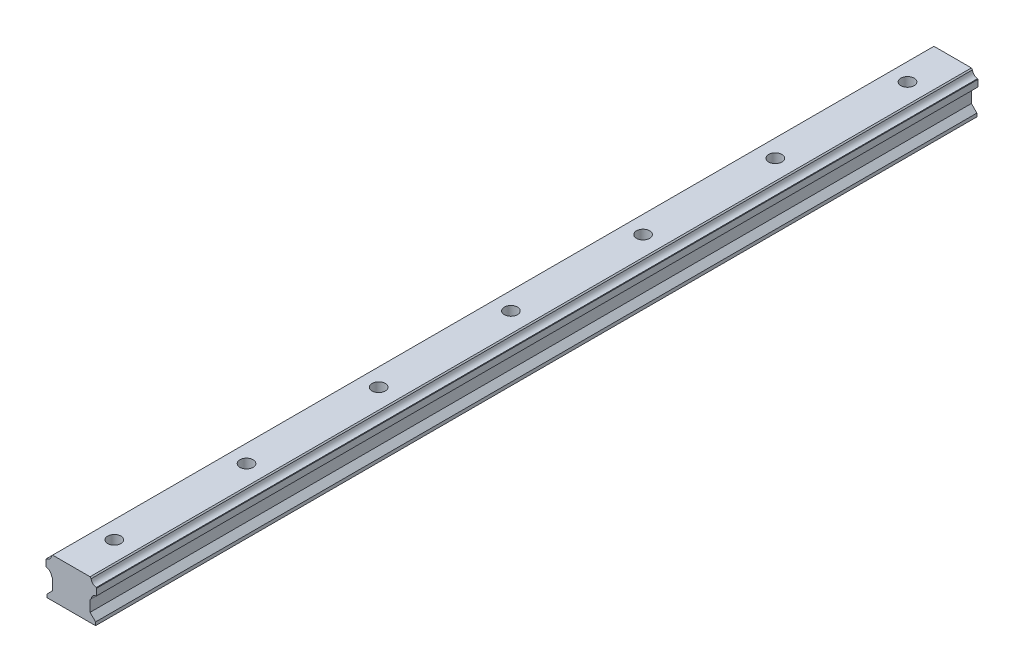
ISO-10303-21;
HEADER;
FILE_DESCRIPTION(('STEP AP214'),'2;1');
FILE_NAME('part.step','',(''),(''),'','','');
FILE_SCHEMA(('AUTOMOTIVE_DESIGN { 1 0 10303 214 1 1 1 1 }'));
ENDSEC;
DATA;
#1=APPLICATION_CONTEXT('core data for automotive mechanical design processes');
#2=APPLICATION_PROTOCOL_DEFINITION('international standard','automotive_design',2000,#1);
#3=PRODUCT_CONTEXT('',#1,'mechanical');
#4=PRODUCT('Part','Part','',(#3));
#5=PRODUCT_RELATED_PRODUCT_CATEGORY('part','',(#4));
#6=PRODUCT_DEFINITION_FORMATION('','',#4);
#7=PRODUCT_DEFINITION_CONTEXT('part definition',#1,'design');
#8=PRODUCT_DEFINITION('design','',#6,#7);
#9=PRODUCT_DEFINITION_SHAPE('','',#8);
#10=(LENGTH_UNIT() NAMED_UNIT(*) SI_UNIT(.MILLI.,.METRE.));
#11=(NAMED_UNIT(*) PLANE_ANGLE_UNIT() SI_UNIT($,.RADIAN.));
#12=(NAMED_UNIT(*) SI_UNIT($,.STERADIAN.) SOLID_ANGLE_UNIT());
#13=UNCERTAINTY_MEASURE_WITH_UNIT(LENGTH_MEASURE(1.E-05),#10,'distance_accuracy_value','');
#14=(GEOMETRIC_REPRESENTATION_CONTEXT(3) GLOBAL_UNCERTAINTY_ASSIGNED_CONTEXT((#13)) GLOBAL_UNIT_ASSIGNED_CONTEXT((#10,
#11,#12)) REPRESENTATION_CONTEXT('',''));
#15=CARTESIAN_POINT('',(0.,0.,0.));
#16=DIRECTION('',(0.,0.,1.));
#17=DIRECTION('',(1.,0.,0.));
#18=AXIS2_PLACEMENT_3D('',#15,#16,#17);
#19=CARTESIAN_POINT('',(-10.0012116020146,-16.2762221715419,400.));
#20=DIRECTION('',(1.,0.,0.));
#21=DIRECTION('',(0.,0.,-1.));
#22=AXIS2_PLACEMENT_3D('',#19,#20,#21);
#23=PLANE('',#22);
#24=DIRECTION('',(0.,-1.,0.));
#25=VECTOR('',#24,1.);
#26=CARTESIAN_POINT('',(-10.0012116020146,-16.2762221715419,0.));
#27=LINE('',#26,#25);
#28=CARTESIAN_POINT('',(-10.0012116020146,-16.2762221715419,0.));
#29=VERTEX_POINT('',#28);
#30=CARTESIAN_POINT('',(-10.0012116020146,-17.7762221715421,0.));
#31=VERTEX_POINT('',#30);
#32=EDGE_CURVE('E215',#29,#31,#27,.T.);
#33=ORIENTED_EDGE('',*,*,#32,.T.);
#34=DIRECTION('',(0.,0.,-1.));
#35=VECTOR('',#34,1.);
#36=CARTESIAN_POINT('',(-10.0012116020146,-17.7762221715421,400.));
#37=LINE('',#36,#35);
#38=CARTESIAN_POINT('',(-10.0012116020146,-17.7762221715421,400.));
#39=VERTEX_POINT('',#38);
#40=EDGE_CURVE('E313',#39,#31,#37,.T.);
#41=ORIENTED_EDGE('',*,*,#40,.F.);
#42=DIRECTION('',(0.,-1.,0.));
#43=VECTOR('',#42,1.);
#44=CARTESIAN_POINT('',(-10.0012116020146,-16.2762221715419,400.));
#45=LINE('',#44,#43);
#46=CARTESIAN_POINT('',(-10.0012116020146,-16.2762221715419,400.));
#47=VERTEX_POINT('',#46);
#48=EDGE_CURVE('E258',#47,#39,#45,.T.);
#49=ORIENTED_EDGE('',*,*,#48,.F.);
#50=DIRECTION('',(0.,0.,-1.));
#51=VECTOR('',#50,1.);
#52=CARTESIAN_POINT('',(-10.0012116020146,-16.2762221715419,400.));
#53=LINE('',#52,#51);
#54=EDGE_CURVE('E211',#47,#29,#53,.T.);
#55=ORIENTED_EDGE('',*,*,#54,.T.);
#56=EDGE_LOOP('',(#33,#41,#49,#55));
#57=FACE_BOUND('',#56,.T.);
#58=ADVANCED_FACE('F33',(#57),#23,.F.);
#59=CARTESIAN_POINT('',(-10.0012116020146,-17.7762221715421,400.));
#60=DIRECTION('',(0.,1.,0.));
#61=DIRECTION('',(0.,0.,1.));
#62=AXIS2_PLACEMENT_3D('',#59,#60,#61);
#63=PLANE('',#62);
#64=CARTESIAN_POINT('',(0.499394198992774,-17.7762221715421,20.0000000000001));
#65=DIRECTION('',(0.,1.,0.));
#66=DIRECTION('',(0.,0.,1.));
#67=AXIS2_PLACEMENT_3D('',#64,#65,#66);
#68=CIRCLE('',#67,3.);
#69=CARTESIAN_POINT('',(0.499394198992774,-17.7762221715421,23.0000000000001));
#70=VERTEX_POINT('',#69);
#71=EDGE_CURVE('E488',#70,#70,#68,.T.);
#72=ORIENTED_EDGE('',*,*,#71,.T.);
#73=EDGE_LOOP('',(#72));
#74=FACE_BOUND('',#73,.T.);
#75=CARTESIAN_POINT('',(0.499394198992774,-17.7762221715421,80.0000000000001));
#76=DIRECTION('',(0.,1.,0.));
#77=DIRECTION('',(0.,0.,1.));
#78=AXIS2_PLACEMENT_3D('',#75,#76,#77);
#79=CIRCLE('',#78,3.);
#80=CARTESIAN_POINT('',(0.499394198992774,-17.7762221715421,83.0000000000001));
#81=VERTEX_POINT('',#80);
#82=EDGE_CURVE('E482',#81,#81,#79,.T.);
#83=ORIENTED_EDGE('',*,*,#82,.T.);
#84=EDGE_LOOP('',(#83));
#85=FACE_BOUND('',#84,.T.);
#86=CARTESIAN_POINT('',(0.499394198992774,-17.7762221715421,140.));
#87=DIRECTION('',(0.,1.,0.));
#88=DIRECTION('',(0.,0.,1.));
#89=AXIS2_PLACEMENT_3D('',#86,#87,#88);
#90=CIRCLE('',#89,3.);
#91=CARTESIAN_POINT('',(0.499394198992774,-17.7762221715421,143.));
#92=VERTEX_POINT('',#91);
#93=EDGE_CURVE('E478',#92,#92,#90,.T.);
#94=ORIENTED_EDGE('',*,*,#93,.T.);
#95=EDGE_LOOP('',(#94));
#96=FACE_BOUND('',#95,.T.);
#97=CARTESIAN_POINT('',(0.499394198992774,-17.7762221715421,260.));
#98=DIRECTION('',(0.,1.,0.));
#99=DIRECTION('',(0.,0.,1.));
#100=AXIS2_PLACEMENT_3D('',#97,#98,#99);
#101=CIRCLE('',#100,3.);
#102=CARTESIAN_POINT('',(0.499394198992774,-17.7762221715421,263.));
#103=VERTEX_POINT('',#102);
#104=EDGE_CURVE('E475',#103,#103,#101,.T.);
#105=ORIENTED_EDGE('',*,*,#104,.T.);
#106=EDGE_LOOP('',(#105));
#107=FACE_BOUND('',#106,.T.);
#108=CARTESIAN_POINT('',(0.499394198992774,-17.7762221715421,200.));
#109=DIRECTION('',(0.,1.,0.));
#110=DIRECTION('',(0.,0.,1.));
#111=AXIS2_PLACEMENT_3D('',#108,#109,#110);
#112=CIRCLE('',#111,3.);
#113=CARTESIAN_POINT('',(0.499394198992774,-17.7762221715421,203.));
#114=VERTEX_POINT('',#113);
#115=EDGE_CURVE('E219',#114,#114,#112,.T.);
#116=ORIENTED_EDGE('',*,*,#115,.T.);
#117=EDGE_LOOP('',(#116));
#118=FACE_BOUND('',#117,.T.);
#119=DIRECTION('',(1.,0.,0.));
#120=VECTOR('',#119,1.);
#121=CARTESIAN_POINT('',(-10.0012116020146,-17.7762221715421,0.));
#122=LINE('',#121,#120);
#123=CARTESIAN_POINT('',(11.9987883979856,-17.7762221715421,0.));
#124=VERTEX_POINT('',#123);
#125=EDGE_CURVE('E218',#31,#124,#122,.T.);
#126=ORIENTED_EDGE('',*,*,#125,.T.);
#127=DIRECTION('',(0.,0.,-1.));
#128=VECTOR('',#127,1.);
#129=CARTESIAN_POINT('',(11.9987883979856,-17.7762221715421,400.));
#130=LINE('',#129,#128);
#131=CARTESIAN_POINT('',(11.9987883979856,-17.7762221715421,400.));
#132=VERTEX_POINT('',#131);
#133=EDGE_CURVE('E310',#132,#124,#130,.T.);
#134=ORIENTED_EDGE('',*,*,#133,.F.);
#135=DIRECTION('',(1.,0.,0.));
#136=VECTOR('',#135,1.);
#137=CARTESIAN_POINT('',(-10.0012116020146,-17.7762221715421,400.));
#138=LINE('',#137,#136);
#139=EDGE_CURVE('E136',#39,#132,#138,.T.);
#140=ORIENTED_EDGE('',*,*,#139,.F.);
#141=ORIENTED_EDGE('',*,*,#40,.T.);
#142=EDGE_LOOP('',(#126,#134,#140,#141));
#143=FACE_BOUND('',#142,.T.);
#144=CARTESIAN_POINT('',(0.499394198992774,-17.7762221715421,320.));
#145=DIRECTION('',(0.,1.,0.));
#146=DIRECTION('',(0.,0.,1.));
#147=AXIS2_PLACEMENT_3D('',#144,#145,#146);
#148=CIRCLE('',#147,3.);
#149=CARTESIAN_POINT('',(0.499394198992774,-17.7762221715421,323.));
#150=VERTEX_POINT('',#149);
#151=EDGE_CURVE('E315',#150,#150,#148,.T.);
#152=ORIENTED_EDGE('',*,*,#151,.T.);
#153=EDGE_LOOP('',(#152));
#154=FACE_BOUND('',#153,.T.);
#155=CARTESIAN_POINT('',(0.499394198992774,-17.7762221715421,380.));
#156=DIRECTION('',(0.,1.,0.));
#157=DIRECTION('',(0.,0.,1.));
#158=AXIS2_PLACEMENT_3D('',#155,#156,#157);
#159=CIRCLE('',#158,3.);
#160=CARTESIAN_POINT('',(0.499394198992774,-17.7762221715421,383.));
#161=VERTEX_POINT('',#160);
#162=EDGE_CURVE('E42',#161,#161,#159,.T.);
#163=ORIENTED_EDGE('',*,*,#162,.T.);
#164=EDGE_LOOP('',(#163));
#165=FACE_BOUND('',#164,.T.);
#166=ADVANCED_FACE('F323',(#74,#85,#96,#107,#118,#143,#154,#165),#63,.F.);
#167=CARTESIAN_POINT('',(11.9987883979856,-17.7762221715421,400.));
#168=DIRECTION('',(-1.,0.,0.));
#169=DIRECTION('',(0.,0.,1.));
#170=AXIS2_PLACEMENT_3D('',#167,#168,#169);
#171=PLANE('',#170);
#172=DIRECTION('',(0.,1.,0.));
#173=VECTOR('',#172,1.);
#174=CARTESIAN_POINT('',(11.9987883979856,-17.7762221715421,0.));
#175=LINE('',#174,#173);
#176=CARTESIAN_POINT('',(11.9987883979856,-16.2762221715418,0.));
#177=VERTEX_POINT('',#176);
#178=EDGE_CURVE('E221',#124,#177,#175,.T.);
#179=ORIENTED_EDGE('',*,*,#178,.T.);
#180=DIRECTION('',(0.,0.,-1.));
#181=VECTOR('',#180,1.);
#182=CARTESIAN_POINT('',(11.9987883979856,-16.2762221715418,400.));
#183=LINE('',#182,#181);
#184=CARTESIAN_POINT('',(11.9987883979856,-16.2762221715418,400.));
#185=VERTEX_POINT('',#184);
#186=EDGE_CURVE('E307',#185,#177,#183,.T.);
#187=ORIENTED_EDGE('',*,*,#186,.F.);
#188=DIRECTION('',(0.,1.,0.));
#189=VECTOR('',#188,1.);
#190=CARTESIAN_POINT('',(11.9987883979856,-17.7762221715421,400.));
#191=LINE('',#190,#189);
#192=EDGE_CURVE('E463',#132,#185,#191,.T.);
#193=ORIENTED_EDGE('',*,*,#192,.F.);
#194=ORIENTED_EDGE('',*,*,#133,.T.);
#195=EDGE_LOOP('',(#179,#187,#193,#194));
#196=FACE_BOUND('',#195,.T.);
#197=ADVANCED_FACE('F355',(#196),#171,.F.);
#198=CARTESIAN_POINT('',(9.49878839798558,-13.7762221715417,400.));
#199=DIRECTION('',(-0.707106781186548,-0.707106781186548,0.));
#200=DIRECTION('',(0.707106781186548,-0.707106781186548,0.));
#201=AXIS2_PLACEMENT_3D('',#198,#199,#200);
#202=PLANE('',#201);
#203=DIRECTION('',(-0.707106781186548,0.707106781186548,0.));
#204=VECTOR('',#203,1.);
#205=CARTESIAN_POINT('',(9.49878839798558,-13.7762221715417,0.));
#206=LINE('',#205,#204);
#207=CARTESIAN_POINT('',(9.49878839798558,-13.7762221715417,0.));
#208=VERTEX_POINT('',#207);
#209=EDGE_CURVE('E223',#177,#208,#206,.T.);
#210=ORIENTED_EDGE('',*,*,#209,.T.);
#211=DIRECTION('',(0.,0.,-1.));
#212=VECTOR('',#211,1.);
#213=CARTESIAN_POINT('',(9.49878839798558,-13.7762221715417,400.));
#214=LINE('',#213,#212);
#215=CARTESIAN_POINT('',(9.49878839798558,-13.7762221715417,400.));
#216=VERTEX_POINT('',#215);
#217=EDGE_CURVE('E304',#216,#208,#214,.T.);
#218=ORIENTED_EDGE('',*,*,#217,.F.);
#219=DIRECTION('',(-0.707106781186548,0.707106781186548,0.));
#220=VECTOR('',#219,1.);
#221=CARTESIAN_POINT('',(9.49878839798558,-13.7762221715417,400.));
#222=LINE('',#221,#220);
#223=EDGE_CURVE('E461',#185,#216,#222,.T.);
#224=ORIENTED_EDGE('',*,*,#223,.F.);
#225=ORIENTED_EDGE('',*,*,#186,.T.);
#226=EDGE_LOOP('',(#210,#218,#224,#225));
#227=FACE_BOUND('',#226,.T.);
#228=ADVANCED_FACE('F567',(#227),#202,.F.);
#229=CARTESIAN_POINT('',(9.49878839798558,-8.77622217154181,400.));
#230=DIRECTION('',(-1.,0.,0.));
#231=DIRECTION('',(0.,0.,1.));
#232=AXIS2_PLACEMENT_3D('',#229,#230,#231);
#233=PLANE('',#232);
#234=DIRECTION('',(0.,1.,0.));
#235=VECTOR('',#234,1.);
#236=CARTESIAN_POINT('',(9.49878839798558,-8.77622217154181,0.));
#237=LINE('',#236,#235);
#238=CARTESIAN_POINT('',(9.49878839798558,-8.77622217154181,0.));
#239=VERTEX_POINT('',#238);
#240=EDGE_CURVE('E225',#208,#239,#237,.T.);
#241=ORIENTED_EDGE('',*,*,#240,.T.);
#242=DIRECTION('',(0.,0.,-1.));
#243=VECTOR('',#242,1.);
#244=CARTESIAN_POINT('',(9.49878839798558,-8.77622217154181,400.));
#245=LINE('',#244,#243);
#246=CARTESIAN_POINT('',(9.49878839798558,-8.77622217154181,400.));
#247=VERTEX_POINT('',#246);
#248=EDGE_CURVE('E301',#247,#239,#245,.T.);
#249=ORIENTED_EDGE('',*,*,#248,.F.);
#250=DIRECTION('',(0.,1.,0.));
#251=VECTOR('',#250,1.);
#252=CARTESIAN_POINT('',(9.49878839798558,-8.77622217154181,400.));
#253=LINE('',#252,#251);
#254=EDGE_CURVE('E459',#216,#247,#253,.T.);
#255=ORIENTED_EDGE('',*,*,#254,.F.);
#256=ORIENTED_EDGE('',*,*,#217,.T.);
#257=EDGE_LOOP('',(#241,#249,#255,#256));
#258=FACE_BOUND('',#257,.T.);
#259=ADVANCED_FACE('F562',(#258),#233,.F.);
#260=CARTESIAN_POINT('',(10.0063729844235,-8.26863758510385,400.));
#261=DIRECTION('',(-0.707106781186548,0.707106781186548,0.));
#262=DIRECTION('',(-0.707106781186548,-0.707106781186548,0.));
#263=AXIS2_PLACEMENT_3D('',#260,#261,#262);
#264=PLANE('',#263);
#265=DIRECTION('',(0.707106781186548,0.707106781186548,0.));
#266=VECTOR('',#265,1.);
#267=CARTESIAN_POINT('',(10.0063729844235,-8.26863758510385,0.));
#268=LINE('',#267,#266);
#269=CARTESIAN_POINT('',(10.0063729844235,-8.26863758510385,0.));
#270=VERTEX_POINT('',#269);
#271=EDGE_CURVE('E227',#239,#270,#268,.T.);
#272=ORIENTED_EDGE('',*,*,#271,.T.);
#273=DIRECTION('',(0.,0.,-1.));
#274=VECTOR('',#273,1.);
#275=CARTESIAN_POINT('',(10.0063729844235,-8.26863758510385,400.));
#276=LINE('',#275,#274);
#277=CARTESIAN_POINT('',(10.0063729844235,-8.26863758510385,400.));
#278=VERTEX_POINT('',#277);
#279=EDGE_CURVE('E298',#278,#270,#276,.T.);
#280=ORIENTED_EDGE('',*,*,#279,.F.);
#281=DIRECTION('',(0.707106781186548,0.707106781186548,0.));
#282=VECTOR('',#281,1.);
#283=CARTESIAN_POINT('',(10.0063729844235,-8.26863758510385,400.));
#284=LINE('',#283,#282);
#285=EDGE_CURVE('E457',#247,#278,#284,.T.);
#286=ORIENTED_EDGE('',*,*,#285,.F.);
#287=ORIENTED_EDGE('',*,*,#248,.T.);
#288=EDGE_LOOP('',(#272,#280,#286,#287));
#289=FACE_BOUND('',#288,.T.);
#290=ADVANCED_FACE('F556',(#289),#264,.F.);
#291=CARTESIAN_POINT('',(12.4987883979856,-8.46322794005069,400.));
#292=DIRECTION('',(0.,0.,-1.));
#293=DIRECTION('',(-1.,0.,0.));
#294=AXIS2_PLACEMENT_3D('',#291,#292,#293);
#295=CYLINDRICAL_SURFACE('',#294,2.5);
#296=CARTESIAN_POINT('',(12.4987883979856,-8.46322794005069,0.));
#297=DIRECTION('',(0.,0.,-1.));
#298=DIRECTION('',(1.,0.,0.));
#299=AXIS2_PLACEMENT_3D('',#296,#297,#298);
#300=CIRCLE('',#299,2.5);
#301=CARTESIAN_POINT('',(12.3041980430387,-5.97081252648865,0.));
#302=VERTEX_POINT('',#301);
#303=EDGE_CURVE('E229',#270,#302,#300,.T.);
#304=ORIENTED_EDGE('',*,*,#303,.T.);
#305=DIRECTION('',(0.,0.,-1.));
#306=VECTOR('',#305,1.);
#307=CARTESIAN_POINT('',(12.3041980430387,-5.97081252648865,400.));
#308=LINE('',#307,#306);
#309=CARTESIAN_POINT('',(12.3041980430387,-5.97081252648865,400.));
#310=VERTEX_POINT('',#309);
#311=EDGE_CURVE('E295',#310,#302,#308,.T.);
#312=ORIENTED_EDGE('',*,*,#311,.F.);
#313=CARTESIAN_POINT('',(12.4987883979856,-8.46322794005069,400.));
#314=DIRECTION('',(0.,0.,-1.));
#315=DIRECTION('',(1.,0.,0.));
#316=AXIS2_PLACEMENT_3D('',#313,#314,#315);
#317=CIRCLE('',#316,2.5);
#318=EDGE_CURVE('E455',#278,#310,#317,.T.);
#319=ORIENTED_EDGE('',*,*,#318,.F.);
#320=ORIENTED_EDGE('',*,*,#279,.T.);
#321=EDGE_LOOP('',(#304,#312,#319,#320));
#322=FACE_BOUND('',#321,.T.);
#323=ADVANCED_FACE('F552',(#322),#295,.F.);
#324=CARTESIAN_POINT('',(12.4987883979856,-5.77622217154175,400.));
#325=DIRECTION('',(-0.707106781186547,0.707106781186547,0.));
#326=DIRECTION('',(-0.707106781186548,-0.707106781186548,0.));
#327=AXIS2_PLACEMENT_3D('',#324,#325,#326);
#328=PLANE('',#327);
#329=DIRECTION('',(0.707106781186547,0.707106781186547,0.));
#330=VECTOR('',#329,1.);
#331=CARTESIAN_POINT('',(12.4987883979856,-5.77622217154175,0.));
#332=LINE('',#331,#330);
#333=CARTESIAN_POINT('',(12.4987883979856,-5.77622217154175,0.));
#334=VERTEX_POINT('',#333);
#335=EDGE_CURVE('E231',#302,#334,#332,.T.);
#336=ORIENTED_EDGE('',*,*,#335,.T.);
#337=DIRECTION('',(0.,0.,-1.));
#338=VECTOR('',#337,1.);
#339=CARTESIAN_POINT('',(12.4987883979856,-5.77622217154175,400.));
#340=LINE('',#339,#338);
#341=CARTESIAN_POINT('',(12.4987883979856,-5.77622217154175,400.));
#342=VERTEX_POINT('',#341);
#343=EDGE_CURVE('E292',#342,#334,#340,.T.);
#344=ORIENTED_EDGE('',*,*,#343,.F.);
#345=DIRECTION('',(0.707106781186547,0.707106781186547,0.));
#346=VECTOR('',#345,1.);
#347=CARTESIAN_POINT('',(12.4987883979856,-5.77622217154175,400.));
#348=LINE('',#347,#346);
#349=EDGE_CURVE('E453',#310,#342,#348,.T.);
#350=ORIENTED_EDGE('',*,*,#349,.F.);
#351=ORIENTED_EDGE('',*,*,#311,.T.);
#352=EDGE_LOOP('',(#336,#344,#350,#351));
#353=FACE_BOUND('',#352,.T.);
#354=ADVANCED_FACE('F547',(#353),#328,.F.);
#355=CARTESIAN_POINT('',(12.4987883979856,-2.77622217154181,400.));
#356=DIRECTION('',(-1.,0.,0.));
#357=DIRECTION('',(0.,0.,1.));
#358=AXIS2_PLACEMENT_3D('',#355,#356,#357);
#359=PLANE('',#358);
#360=DIRECTION('',(0.,1.,0.));
#361=VECTOR('',#360,1.);
#362=CARTESIAN_POINT('',(12.4987883979856,-2.77622217154181,0.));
#363=LINE('',#362,#361);
#364=CARTESIAN_POINT('',(12.4987883979856,-2.77622217154181,0.));
#365=VERTEX_POINT('',#364);
#366=EDGE_CURVE('E233',#334,#365,#363,.T.);
#367=ORIENTED_EDGE('',*,*,#366,.T.);
#368=DIRECTION('',(0.,0.,-1.));
#369=VECTOR('',#368,1.);
#370=CARTESIAN_POINT('',(12.4987883979856,-2.77622217154181,400.));
#371=LINE('',#370,#369);
#372=CARTESIAN_POINT('',(12.4987883979856,-2.77622217154181,400.));
#373=VERTEX_POINT('',#372);
#374=EDGE_CURVE('E289',#373,#365,#371,.T.);
#375=ORIENTED_EDGE('',*,*,#374,.F.);
#376=DIRECTION('',(0.,1.,0.));
#377=VECTOR('',#376,1.);
#378=CARTESIAN_POINT('',(12.4987883979856,-2.77622217154181,400.));
#379=LINE('',#378,#377);
#380=EDGE_CURVE('E451',#342,#373,#379,.T.);
#381=ORIENTED_EDGE('',*,*,#380,.F.);
#382=ORIENTED_EDGE('',*,*,#343,.T.);
#383=EDGE_LOOP('',(#367,#375,#381,#382));
#384=FACE_BOUND('',#383,.T.);
#385=ADVANCED_FACE('F541',(#384),#359,.F.);
#386=CARTESIAN_POINT('',(12.3041980430388,-2.58163181659496,400.));
#387=DIRECTION('',(-0.707106781186547,-0.707106781186547,0.));
#388=DIRECTION('',(0.707106781186548,-0.707106781186548,0.));
#389=AXIS2_PLACEMENT_3D('',#386,#387,#388);
#390=PLANE('',#389);
#391=DIRECTION('',(-0.707106781186547,0.707106781186547,0.));
#392=VECTOR('',#391,1.);
#393=CARTESIAN_POINT('',(12.3041980430388,-2.58163181659496,0.));
#394=LINE('',#393,#392);
#395=CARTESIAN_POINT('',(12.3041980430388,-2.58163181659496,0.));
#396=VERTEX_POINT('',#395);
#397=EDGE_CURVE('E235',#365,#396,#394,.T.);
#398=ORIENTED_EDGE('',*,*,#397,.T.);
#399=DIRECTION('',(0.,0.,-1.));
#400=VECTOR('',#399,1.);
#401=CARTESIAN_POINT('',(12.3041980430388,-2.58163181659496,400.));
#402=LINE('',#401,#400);
#403=CARTESIAN_POINT('',(12.3041980430388,-2.58163181659496,400.));
#404=VERTEX_POINT('',#403);
#405=EDGE_CURVE('E286',#404,#396,#402,.T.);
#406=ORIENTED_EDGE('',*,*,#405,.F.);
#407=DIRECTION('',(-0.707106781186547,0.707106781186547,0.));
#408=VECTOR('',#407,1.);
#409=CARTESIAN_POINT('',(12.3041980430388,-2.58163181659496,400.));
#410=LINE('',#409,#408);
#411=EDGE_CURVE('E449',#373,#404,#410,.T.);
#412=ORIENTED_EDGE('',*,*,#411,.F.);
#413=ORIENTED_EDGE('',*,*,#374,.T.);
#414=EDGE_LOOP('',(#398,#406,#412,#413));
#415=FACE_BOUND('',#414,.T.);
#416=ADVANCED_FACE('F537',(#415),#390,.F.);
#417=CARTESIAN_POINT('',(12.4987883979856,-0.0892164030329295,400.));
#418=DIRECTION('',(0.,0.,-1.));
#419=DIRECTION('',(-1.,0.,0.));
#420=AXIS2_PLACEMENT_3D('',#417,#418,#419);
#421=CYLINDRICAL_SURFACE('',#420,2.49999999999998);
#422=CARTESIAN_POINT('',(12.4987883979856,-0.0892164030329295,0.));
#423=DIRECTION('',(0.,0.,-1.));
#424=DIRECTION('',(1.,0.,0.));
#425=AXIS2_PLACEMENT_3D('',#422,#423,#424);
#426=CIRCLE('',#425,2.49999999999998);
#427=CARTESIAN_POINT('',(10.0063729844236,-0.283806757979913,0.));
#428=VERTEX_POINT('',#427);
#429=EDGE_CURVE('E237',#396,#428,#426,.T.);
#430=ORIENTED_EDGE('',*,*,#429,.T.);
#431=DIRECTION('',(0.,0.,-1.));
#432=VECTOR('',#431,1.);
#433=CARTESIAN_POINT('',(10.0063729844236,-0.283806757979913,400.));
#434=LINE('',#433,#432);
#435=CARTESIAN_POINT('',(10.0063729844236,-0.283806757979913,400.));
#436=VERTEX_POINT('',#435);
#437=EDGE_CURVE('E283',#436,#428,#434,.T.);
#438=ORIENTED_EDGE('',*,*,#437,.F.);
#439=CARTESIAN_POINT('',(12.4987883979856,-0.0892164030329295,400.));
#440=DIRECTION('',(0.,0.,-1.));
#441=DIRECTION('',(1.,0.,0.));
#442=AXIS2_PLACEMENT_3D('',#439,#440,#441);
#443=CIRCLE('',#442,2.49999999999998);
#444=EDGE_CURVE('E447',#404,#436,#443,.T.);
#445=ORIENTED_EDGE('',*,*,#444,.F.);
#446=ORIENTED_EDGE('',*,*,#405,.T.);
#447=EDGE_LOOP('',(#430,#438,#445,#446));
#448=FACE_BOUND('',#447,.T.);
#449=ADVANCED_FACE('F344',(#448),#421,.F.);
#450=CARTESIAN_POINT('',(9.49878839798586,0.223777828457852,400.));
#451=DIRECTION('',(-0.707106781186548,-0.707106781186548,0.));
#452=DIRECTION('',(0.707106781186548,-0.707106781186548,0.));
#453=AXIS2_PLACEMENT_3D('',#450,#451,#452);
#454=PLANE('',#453);
#455=DIRECTION('',(-0.707106781186548,0.707106781186548,0.));
#456=VECTOR('',#455,1.);
#457=CARTESIAN_POINT('',(9.49878839798586,0.223777828457852,0.));
#458=LINE('',#457,#456);
#459=CARTESIAN_POINT('',(9.49878839798586,0.223777828457852,0.));
#460=VERTEX_POINT('',#459);
#461=EDGE_CURVE('E239',#428,#460,#458,.T.);
#462=ORIENTED_EDGE('',*,*,#461,.T.);
#463=DIRECTION('',(0.,0.,-1.));
#464=VECTOR('',#463,1.);
#465=CARTESIAN_POINT('',(9.49878839798586,0.223777828457852,400.));
#466=LINE('',#465,#464);
#467=CARTESIAN_POINT('',(9.49878839798586,0.223777828457852,400.));
#468=VERTEX_POINT('',#467);
#469=EDGE_CURVE('E280',#468,#460,#466,.T.);
#470=ORIENTED_EDGE('',*,*,#469,.F.);
#471=DIRECTION('',(-0.707106781186548,0.707106781186548,0.));
#472=VECTOR('',#471,1.);
#473=CARTESIAN_POINT('',(9.49878839798586,0.223777828457852,400.));
#474=LINE('',#473,#472);
#475=EDGE_CURVE('E445',#436,#468,#474,.T.);
#476=ORIENTED_EDGE('',*,*,#475,.F.);
#477=ORIENTED_EDGE('',*,*,#437,.T.);
#478=EDGE_LOOP('',(#462,#470,#476,#477));
#479=FACE_BOUND('',#478,.T.);
#480=ADVANCED_FACE('F334',(#479),#454,.F.);
#481=CARTESIAN_POINT('',(-7.50121160201476,0.223777828457852,400.));
#482=DIRECTION('',(0.,-1.,0.));
#483=DIRECTION('',(0.,0.,-1.));
#484=AXIS2_PLACEMENT_3D('',#481,#482,#483);
#485=PLANE('',#484);
#486=CARTESIAN_POINT('',(0.499394198992774,0.223777828457852,20.0000000000001));
#487=DIRECTION('',(0.,1.,0.));
#488=DIRECTION('',(0.,0.,1.));
#489=AXIS2_PLACEMENT_3D('',#486,#487,#488);
#490=CIRCLE('',#489,3.);
#491=CARTESIAN_POINT('',(0.499394198992774,0.223777828457852,23.0000000000001));
#492=VERTEX_POINT('',#491);
#493=EDGE_CURVE('E491',#492,#492,#490,.T.);
#494=ORIENTED_EDGE('',*,*,#493,.F.);
#495=EDGE_LOOP('',(#494));
#496=FACE_BOUND('',#495,.T.);
#497=CARTESIAN_POINT('',(0.499394198992774,0.223777828457852,80.0000000000001));
#498=DIRECTION('',(0.,1.,0.));
#499=DIRECTION('',(0.,0.,1.));
#500=AXIS2_PLACEMENT_3D('',#497,#498,#499);
#501=CIRCLE('',#500,3.);
#502=CARTESIAN_POINT('',(0.499394198992774,0.223777828457852,83.0000000000001));
#503=VERTEX_POINT('',#502);
#504=EDGE_CURVE('E485',#503,#503,#501,.T.);
#505=ORIENTED_EDGE('',*,*,#504,.F.);
#506=EDGE_LOOP('',(#505));
#507=FACE_BOUND('',#506,.T.);
#508=CARTESIAN_POINT('',(0.499394198992774,0.223777828457852,140.));
#509=DIRECTION('',(0.,1.,0.));
#510=DIRECTION('',(0.,0.,1.));
#511=AXIS2_PLACEMENT_3D('',#508,#509,#510);
#512=CIRCLE('',#511,3.);
#513=CARTESIAN_POINT('',(0.499394198992774,0.223777828457852,143.));
#514=VERTEX_POINT('',#513);
#515=EDGE_CURVE('E479',#514,#514,#512,.T.);
#516=ORIENTED_EDGE('',*,*,#515,.F.);
#517=EDGE_LOOP('',(#516));
#518=FACE_BOUND('',#517,.T.);
#519=CARTESIAN_POINT('',(0.499394198992774,0.223777828457852,260.));
#520=DIRECTION('',(0.,1.,0.));
#521=DIRECTION('',(0.,0.,1.));
#522=AXIS2_PLACEMENT_3D('',#519,#520,#521);
#523=CIRCLE('',#522,3.);
#524=CARTESIAN_POINT('',(0.499394198992774,0.223777828457852,263.));
#525=VERTEX_POINT('',#524);
#526=EDGE_CURVE('E470',#525,#525,#523,.T.);
#527=ORIENTED_EDGE('',*,*,#526,.F.);
#528=EDGE_LOOP('',(#527));
#529=FACE_BOUND('',#528,.T.);
#530=CARTESIAN_POINT('',(0.499394198992774,0.223777828457852,200.));
#531=DIRECTION('',(0.,1.,0.));
#532=DIRECTION('',(0.,0.,1.));
#533=AXIS2_PLACEMENT_3D('',#530,#531,#532);
#534=CIRCLE('',#533,3.);
#535=CARTESIAN_POINT('',(0.499394198992774,0.223777828457852,203.));
#536=VERTEX_POINT('',#535);
#537=EDGE_CURVE('E467',#536,#536,#534,.T.);
#538=ORIENTED_EDGE('',*,*,#537,.F.);
#539=EDGE_LOOP('',(#538));
#540=FACE_BOUND('',#539,.T.);
#541=DIRECTION('',(-1.,0.,0.));
#542=VECTOR('',#541,1.);
#543=CARTESIAN_POINT('',(-7.50121160201476,0.223777828457852,0.));
#544=LINE('',#543,#542);
#545=CARTESIAN_POINT('',(-7.50121160201476,0.223777828457852,0.));
#546=VERTEX_POINT('',#545);
#547=EDGE_CURVE('E241',#460,#546,#544,.T.);
#548=ORIENTED_EDGE('',*,*,#547,.T.);
#549=DIRECTION('',(0.,0.,-1.));
#550=VECTOR('',#549,1.);
#551=CARTESIAN_POINT('',(-7.50121160201476,0.223777828457852,400.));
#552=LINE('',#551,#550);
#553=CARTESIAN_POINT('',(-7.50121160201476,0.223777828457852,400.));
#554=VERTEX_POINT('',#553);
#555=EDGE_CURVE('E277',#554,#546,#552,.T.);
#556=ORIENTED_EDGE('',*,*,#555,.F.);
#557=DIRECTION('',(-1.,0.,0.));
#558=VECTOR('',#557,1.);
#559=CARTESIAN_POINT('',(-7.50121160201476,0.223777828457852,400.));
#560=LINE('',#559,#558);
#561=EDGE_CURVE('E443',#468,#554,#560,.T.);
#562=ORIENTED_EDGE('',*,*,#561,.F.);
#563=ORIENTED_EDGE('',*,*,#469,.T.);
#564=EDGE_LOOP('',(#548,#556,#562,#563));
#565=FACE_BOUND('',#564,.T.);
#566=CARTESIAN_POINT('',(0.499394198992774,0.223777828457852,320.));
#567=DIRECTION('',(0.,1.,0.));
#568=DIRECTION('',(0.,0.,1.));
#569=AXIS2_PLACEMENT_3D('',#566,#567,#568);
#570=CIRCLE('',#569,3.);
#571=CARTESIAN_POINT('',(0.499394198992774,0.223777828457852,323.));
#572=VERTEX_POINT('',#571);
#573=EDGE_CURVE('E318',#572,#572,#570,.T.);
#574=ORIENTED_EDGE('',*,*,#573,.F.);
#575=EDGE_LOOP('',(#574));
#576=FACE_BOUND('',#575,.T.);
#577=CARTESIAN_POINT('',(0.499394198992774,0.223777828457852,380.));
#578=DIRECTION('',(0.,1.,0.));
#579=DIRECTION('',(0.,0.,1.));
#580=AXIS2_PLACEMENT_3D('',#577,#578,#579);
#581=CIRCLE('',#580,3.);
#582=CARTESIAN_POINT('',(0.499394198992774,0.223777828457852,383.));
#583=VERTEX_POINT('',#582);
#584=EDGE_CURVE('E11',#583,#583,#581,.T.);
#585=ORIENTED_EDGE('',*,*,#584,.F.);
#586=EDGE_LOOP('',(#585));
#587=FACE_BOUND('',#586,.T.);
#588=ADVANCED_FACE('F331',(#496,#507,#518,#529,#540,#565,#576,#587),#485,.F.);
#589=CARTESIAN_POINT('',(-8.0087961884529,-0.283806757980287,400.));
#590=DIRECTION('',(0.707106781186549,-0.707106781186546,0.));
#591=DIRECTION('',(0.707106781186546,0.707106781186549,0.));
#592=AXIS2_PLACEMENT_3D('',#589,#590,#591);
#593=PLANE('',#592);
#594=DIRECTION('',(-0.707106781186546,-0.707106781186549,0.));
#595=VECTOR('',#594,1.);
#596=CARTESIAN_POINT('',(-8.0087961884529,-0.283806757980287,0.));
#597=LINE('',#596,#595);
#598=CARTESIAN_POINT('',(-8.00879618845291,-0.283806757980287,0.));
#599=VERTEX_POINT('',#598);
#600=EDGE_CURVE('E243',#546,#599,#597,.T.);
#601=ORIENTED_EDGE('',*,*,#600,.T.);
#602=DIRECTION('',(0.,0.,-1.));
#603=VECTOR('',#602,1.);
#604=CARTESIAN_POINT('',(-8.00879618845291,-0.283806757980287,400.));
#605=LINE('',#604,#603);
#606=CARTESIAN_POINT('',(-8.00879618845291,-0.283806757980287,400.));
#607=VERTEX_POINT('',#606);
#608=EDGE_CURVE('E274',#607,#599,#605,.T.);
#609=ORIENTED_EDGE('',*,*,#608,.F.);
#610=DIRECTION('',(-0.707106781186546,-0.707106781186549,0.));
#611=VECTOR('',#610,1.);
#612=CARTESIAN_POINT('',(-8.0087961884529,-0.283806757980287,400.));
#613=LINE('',#612,#611);
#614=EDGE_CURVE('E441',#554,#607,#613,.T.);
#615=ORIENTED_EDGE('',*,*,#614,.F.);
#616=ORIENTED_EDGE('',*,*,#555,.T.);
#617=EDGE_LOOP('',(#601,#609,#615,#616));
#618=FACE_BOUND('',#617,.T.);
#619=ADVANCED_FACE('F333',(#618),#593,.F.);
#620=CARTESIAN_POINT('',(-10.5012116020148,-0.0892164030332557,400.));
#621=DIRECTION('',(0.,0.,-1.));
#622=DIRECTION('',(-1.,0.,0.));
#623=AXIS2_PLACEMENT_3D('',#620,#621,#622);
#624=CYLINDRICAL_SURFACE('',#623,2.49999999999983);
#625=CARTESIAN_POINT('',(-10.5012116020148,-0.0892164030332557,0.));
#626=DIRECTION('',(0.,0.,-1.));
#627=DIRECTION('',(1.,0.,0.));
#628=AXIS2_PLACEMENT_3D('',#625,#626,#627);
#629=CIRCLE('',#628,2.49999999999983);
#630=CARTESIAN_POINT('',(-10.3066212470681,-2.58163181659515,0.));
#631=VERTEX_POINT('',#630);
#632=EDGE_CURVE('E245',#599,#631,#629,.T.);
#633=ORIENTED_EDGE('',*,*,#632,.T.);
#634=DIRECTION('',(0.,0.,-1.));
#635=VECTOR('',#634,1.);
#636=CARTESIAN_POINT('',(-10.3066212470681,-2.58163181659515,400.));
#637=LINE('',#636,#635);
#638=CARTESIAN_POINT('',(-10.3066212470681,-2.58163181659515,400.));
#639=VERTEX_POINT('',#638);
#640=EDGE_CURVE('E271',#639,#631,#637,.T.);
#641=ORIENTED_EDGE('',*,*,#640,.F.);
#642=CARTESIAN_POINT('',(-10.5012116020148,-0.0892164030332557,400.));
#643=DIRECTION('',(0.,0.,-1.));
#644=DIRECTION('',(1.,0.,0.));
#645=AXIS2_PLACEMENT_3D('',#642,#643,#644);
#646=CIRCLE('',#645,2.49999999999983);
#647=EDGE_CURVE('E439',#607,#639,#646,.T.);
#648=ORIENTED_EDGE('',*,*,#647,.F.);
#649=ORIENTED_EDGE('',*,*,#608,.T.);
#650=EDGE_LOOP('',(#633,#641,#648,#649));
#651=FACE_BOUND('',#650,.T.);
#652=ADVANCED_FACE('F341',(#651),#624,.F.);
#653=CARTESIAN_POINT('',(-10.5012116020148,-2.77622217154183,400.));
#654=DIRECTION('',(0.707106781186548,-0.707106781186548,0.));
#655=DIRECTION('',(0.707106781186548,0.707106781186548,0.));
#656=AXIS2_PLACEMENT_3D('',#653,#654,#655);
#657=PLANE('',#656);
#658=DIRECTION('',(-0.707106781186548,-0.707106781186548,0.));
#659=VECTOR('',#658,1.);
#660=CARTESIAN_POINT('',(-10.5012116020148,-2.77622217154183,0.));
#661=LINE('',#660,#659);
#662=CARTESIAN_POINT('',(-10.5012116020148,-2.77622217154183,0.));
#663=VERTEX_POINT('',#662);
#664=EDGE_CURVE('E247',#631,#663,#661,.T.);
#665=ORIENTED_EDGE('',*,*,#664,.T.);
#666=DIRECTION('',(0.,0.,-1.));
#667=VECTOR('',#666,1.);
#668=CARTESIAN_POINT('',(-10.5012116020148,-2.77622217154183,400.));
#669=LINE('',#668,#667);
#670=CARTESIAN_POINT('',(-10.5012116020148,-2.77622217154183,400.));
#671=VERTEX_POINT('',#670);
#672=EDGE_CURVE('E268',#671,#663,#669,.T.);
#673=ORIENTED_EDGE('',*,*,#672,.F.);
#674=DIRECTION('',(-0.707106781186548,-0.707106781186548,0.));
#675=VECTOR('',#674,1.);
#676=CARTESIAN_POINT('',(-10.5012116020148,-2.77622217154183,400.));
#677=LINE('',#676,#675);
#678=EDGE_CURVE('E424',#639,#671,#677,.T.);
#679=ORIENTED_EDGE('',*,*,#678,.F.);
#680=ORIENTED_EDGE('',*,*,#640,.T.);
#681=EDGE_LOOP('',(#665,#673,#679,#680));
#682=FACE_BOUND('',#681,.T.);
#683=ADVANCED_FACE('F407',(#682),#657,.F.);
#684=CARTESIAN_POINT('',(-10.5012116020148,-5.77622217154183,400.));
#685=DIRECTION('',(1.,0.,0.));
#686=DIRECTION('',(0.,0.,-1.));
#687=AXIS2_PLACEMENT_3D('',#684,#685,#686);
#688=PLANE('',#687);
#689=DIRECTION('',(0.,-1.,0.));
#690=VECTOR('',#689,1.);
#691=CARTESIAN_POINT('',(-10.5012116020148,-5.77622217154183,0.));
#692=LINE('',#691,#690);
#693=CARTESIAN_POINT('',(-10.5012116020148,-5.77622217154183,0.));
#694=VERTEX_POINT('',#693);
#695=EDGE_CURVE('E249',#663,#694,#692,.T.);
#696=ORIENTED_EDGE('',*,*,#695,.T.);
#697=DIRECTION('',(0.,0.,-1.));
#698=VECTOR('',#697,1.);
#699=CARTESIAN_POINT('',(-10.5012116020148,-5.77622217154183,400.));
#700=LINE('',#699,#698);
#701=CARTESIAN_POINT('',(-10.5012116020148,-5.77622217154183,400.));
#702=VERTEX_POINT('',#701);
#703=EDGE_CURVE('E265',#702,#694,#700,.T.);
#704=ORIENTED_EDGE('',*,*,#703,.F.);
#705=DIRECTION('',(0.,-1.,0.));
#706=VECTOR('',#705,1.);
#707=CARTESIAN_POINT('',(-10.5012116020148,-5.77622217154183,400.));
#708=LINE('',#707,#706);
#709=EDGE_CURVE('E434',#671,#702,#708,.T.);
#710=ORIENTED_EDGE('',*,*,#709,.F.);
#711=ORIENTED_EDGE('',*,*,#672,.T.);
#712=EDGE_LOOP('',(#696,#704,#710,#711));
#713=FACE_BOUND('',#712,.T.);
#714=ADVANCED_FACE('F403',(#713),#688,.F.);
#715=CARTESIAN_POINT('',(-10.3066212470679,-5.97081252648868,400.));
#716=DIRECTION('',(0.707106781186548,0.707106781186548,0.));
#717=DIRECTION('',(-0.707106781186548,0.707106781186548,0.));
#718=AXIS2_PLACEMENT_3D('',#715,#716,#717);
#719=PLANE('',#718);
#720=DIRECTION('',(0.707106781186548,-0.707106781186548,0.));
#721=VECTOR('',#720,1.);
#722=CARTESIAN_POINT('',(-10.3066212470679,-5.97081252648868,0.));
#723=LINE('',#722,#721);
#724=CARTESIAN_POINT('',(-10.3066212470679,-5.97081252648868,0.));
#725=VERTEX_POINT('',#724);
#726=EDGE_CURVE('E251',#694,#725,#723,.T.);
#727=ORIENTED_EDGE('',*,*,#726,.T.);
#728=DIRECTION('',(0.,0.,-1.));
#729=VECTOR('',#728,1.);
#730=CARTESIAN_POINT('',(-10.3066212470679,-5.97081252648868,400.));
#731=LINE('',#730,#729);
#732=CARTESIAN_POINT('',(-10.3066212470679,-5.97081252648868,400.));
#733=VERTEX_POINT('',#732);
#734=EDGE_CURVE('E262',#733,#725,#731,.T.);
#735=ORIENTED_EDGE('',*,*,#734,.F.);
#736=DIRECTION('',(0.707106781186548,-0.707106781186548,0.));
#737=VECTOR('',#736,1.);
#738=CARTESIAN_POINT('',(-10.3066212470679,-5.97081252648868,400.));
#739=LINE('',#738,#737);
#740=EDGE_CURVE('E433',#702,#733,#739,.T.);
#741=ORIENTED_EDGE('',*,*,#740,.F.);
#742=ORIENTED_EDGE('',*,*,#703,.T.);
#743=EDGE_LOOP('',(#727,#735,#741,#742));
#744=FACE_BOUND('',#743,.T.);
#745=ADVANCED_FACE('F399',(#744),#719,.F.);
#746=CARTESIAN_POINT('',(-10.5012116020148,-8.46322794005072,400.));
#747=DIRECTION('',(0.,0.,-1.));
#748=DIRECTION('',(-1.,0.,0.));
#749=AXIS2_PLACEMENT_3D('',#746,#747,#748);
#750=CYLINDRICAL_SURFACE('',#749,2.5);
#751=CARTESIAN_POINT('',(-10.5012116020148,-8.46322794005072,0.));
#752=DIRECTION('',(0.,0.,-1.));
#753=DIRECTION('',(1.,0.,0.));
#754=AXIS2_PLACEMENT_3D('',#751,#752,#753);
#755=CIRCLE('',#754,2.5);
#756=CARTESIAN_POINT('',(-8.00879618845272,-8.26863758510388,0.));
#757=VERTEX_POINT('',#756);
#758=EDGE_CURVE('E253',#725,#757,#755,.T.);
#759=ORIENTED_EDGE('',*,*,#758,.T.);
#760=DIRECTION('',(0.,0.,-1.));
#761=VECTOR('',#760,1.);
#762=CARTESIAN_POINT('',(-8.00879618845272,-8.26863758510388,400.));
#763=LINE('',#762,#761);
#764=CARTESIAN_POINT('',(-8.00879618845272,-8.26863758510388,400.));
#765=VERTEX_POINT('',#764);
#766=EDGE_CURVE('E206',#765,#757,#763,.T.);
#767=ORIENTED_EDGE('',*,*,#766,.F.);
#768=CARTESIAN_POINT('',(-10.5012116020148,-8.46322794005072,400.));
#769=DIRECTION('',(0.,0.,-1.));
#770=DIRECTION('',(1.,0.,0.));
#771=AXIS2_PLACEMENT_3D('',#768,#769,#770);
#772=CIRCLE('',#771,2.5);
#773=EDGE_CURVE('E197',#733,#765,#772,.T.);
#774=ORIENTED_EDGE('',*,*,#773,.F.);
#775=ORIENTED_EDGE('',*,*,#734,.T.);
#776=EDGE_LOOP('',(#759,#767,#774,#775));
#777=FACE_BOUND('',#776,.T.);
#778=ADVANCED_FACE('F396',(#777),#750,.F.);
#779=CARTESIAN_POINT('',(-7.50121160201465,-8.77622217154195,400.));
#780=DIRECTION('',(0.707106781186548,0.707106781186548,0.));
#781=DIRECTION('',(-0.707106781186548,0.707106781186548,0.));
#782=AXIS2_PLACEMENT_3D('',#779,#780,#781);
#783=PLANE('',#782);
#784=DIRECTION('',(0.707106781186548,-0.707106781186548,0.));
#785=VECTOR('',#784,1.);
#786=CARTESIAN_POINT('',(-7.50121160201465,-8.77622217154195,0.));
#787=LINE('',#786,#785);
#788=CARTESIAN_POINT('',(-7.50121160201465,-8.77622217154195,0.));
#789=VERTEX_POINT('',#788);
#790=EDGE_CURVE('E205',#757,#789,#787,.T.);
#791=ORIENTED_EDGE('',*,*,#790,.T.);
#792=DIRECTION('',(0.,0.,-1.));
#793=VECTOR('',#792,1.);
#794=CARTESIAN_POINT('',(-7.50121160201465,-8.77622217154195,400.));
#795=LINE('',#794,#793);
#796=CARTESIAN_POINT('',(-7.50121160201465,-8.77622217154195,400.));
#797=VERTEX_POINT('',#796);
#798=EDGE_CURVE('E202',#797,#789,#795,.T.);
#799=ORIENTED_EDGE('',*,*,#798,.F.);
#800=DIRECTION('',(0.707106781186548,-0.707106781186548,0.));
#801=VECTOR('',#800,1.);
#802=CARTESIAN_POINT('',(-7.50121160201465,-8.77622217154195,400.));
#803=LINE('',#802,#801);
#804=EDGE_CURVE('E191',#765,#797,#803,.T.);
#805=ORIENTED_EDGE('',*,*,#804,.F.);
#806=ORIENTED_EDGE('',*,*,#766,.T.);
#807=EDGE_LOOP('',(#791,#799,#805,#806));
#808=FACE_BOUND('',#807,.T.);
#809=ADVANCED_FACE('F203',(#808),#783,.F.);
#810=CARTESIAN_POINT('',(-7.50121160201465,-13.7762221715419,400.));
#811=DIRECTION('',(1.,0.,0.));
#812=DIRECTION('',(0.,0.,-1.));
#813=AXIS2_PLACEMENT_3D('',#810,#811,#812);
#814=PLANE('',#813);
#815=DIRECTION('',(0.,-1.,0.));
#816=VECTOR('',#815,1.);
#817=CARTESIAN_POINT('',(-7.50121160201465,-13.7762221715419,0.));
#818=LINE('',#817,#816);
#819=CARTESIAN_POINT('',(-7.50121160201465,-13.7762221715419,0.));
#820=VERTEX_POINT('',#819);
#821=EDGE_CURVE('E121',#789,#820,#818,.T.);
#822=ORIENTED_EDGE('',*,*,#821,.T.);
#823=DIRECTION('',(0.,0.,-1.));
#824=VECTOR('',#823,1.);
#825=CARTESIAN_POINT('',(-7.50121160201465,-13.7762221715419,400.));
#826=LINE('',#825,#824);
#827=CARTESIAN_POINT('',(-7.50121160201465,-13.7762221715419,400.));
#828=VERTEX_POINT('',#827);
#829=EDGE_CURVE('E207',#828,#820,#826,.T.);
#830=ORIENTED_EDGE('',*,*,#829,.F.);
#831=DIRECTION('',(0.,-1.,0.));
#832=VECTOR('',#831,1.);
#833=CARTESIAN_POINT('',(-7.50121160201465,-13.7762221715419,400.));
#834=LINE('',#833,#832);
#835=EDGE_CURVE('E195',#797,#828,#834,.T.);
#836=ORIENTED_EDGE('',*,*,#835,.F.);
#837=ORIENTED_EDGE('',*,*,#798,.T.);
#838=EDGE_LOOP('',(#822,#830,#836,#837));
#839=FACE_BOUND('',#838,.T.);
#840=ADVANCED_FACE('F209',(#839),#814,.F.);
#841=CARTESIAN_POINT('',(-10.0012116020146,-16.2762221715419,400.));
#842=DIRECTION('',(0.707106781186547,-0.707106781186548,0.));
#843=DIRECTION('',(0.707106781186548,0.707106781186547,0.));
#844=AXIS2_PLACEMENT_3D('',#841,#842,#843);
#845=PLANE('',#844);
#846=DIRECTION('',(-0.707106781186548,-0.707106781186547,0.));
#847=VECTOR('',#846,1.);
#848=CARTESIAN_POINT('',(-10.0012116020146,-16.2762221715419,0.));
#849=LINE('',#848,#847);
#850=EDGE_CURVE('E127',#820,#29,#849,.T.);
#851=ORIENTED_EDGE('',*,*,#850,.T.);
#852=ORIENTED_EDGE('',*,*,#54,.F.);
#853=DIRECTION('',(-0.707106781186548,-0.707106781186547,0.));
#854=VECTOR('',#853,1.);
#855=CARTESIAN_POINT('',(-10.0012116020146,-16.2762221715419,400.));
#856=LINE('',#855,#854);
#857=EDGE_CURVE('E50',#828,#47,#856,.T.);
#858=ORIENTED_EDGE('',*,*,#857,.F.);
#859=ORIENTED_EDGE('',*,*,#829,.T.);
#860=EDGE_LOOP('',(#851,#852,#858,#859));
#861=FACE_BOUND('',#860,.T.);
#862=ADVANCED_FACE('F386',(#861),#845,.F.);
#863=CARTESIAN_POINT('',(12.4987883979856,-8.46322794005069,400.));
#864=DIRECTION('',(0.,0.,1.));
#865=DIRECTION('',(1.,0.,0.));
#866=AXIS2_PLACEMENT_3D('',#863,#864,#865);
#867=PLANE('',#866);
#868=ORIENTED_EDGE('',*,*,#48,.T.);
#869=ORIENTED_EDGE('',*,*,#139,.T.);
#870=ORIENTED_EDGE('',*,*,#192,.T.);
#871=ORIENTED_EDGE('',*,*,#223,.T.);
#872=ORIENTED_EDGE('',*,*,#254,.T.);
#873=ORIENTED_EDGE('',*,*,#285,.T.);
#874=ORIENTED_EDGE('',*,*,#318,.T.);
#875=ORIENTED_EDGE('',*,*,#349,.T.);
#876=ORIENTED_EDGE('',*,*,#380,.T.);
#877=ORIENTED_EDGE('',*,*,#411,.T.);
#878=ORIENTED_EDGE('',*,*,#444,.T.);
#879=ORIENTED_EDGE('',*,*,#475,.T.);
#880=ORIENTED_EDGE('',*,*,#561,.T.);
#881=ORIENTED_EDGE('',*,*,#614,.T.);
#882=ORIENTED_EDGE('',*,*,#647,.T.);
#883=ORIENTED_EDGE('',*,*,#678,.T.);
#884=ORIENTED_EDGE('',*,*,#709,.T.);
#885=ORIENTED_EDGE('',*,*,#740,.T.);
#886=ORIENTED_EDGE('',*,*,#773,.T.);
#887=ORIENTED_EDGE('',*,*,#804,.T.);
#888=ORIENTED_EDGE('',*,*,#835,.T.);
#889=ORIENTED_EDGE('',*,*,#857,.T.);
#890=EDGE_LOOP('',(#868,#869,#870,#871,#872,#873,#874,#875,#876,#877,#878,#879,#880,#881,#882,
#883,#884,#885,#886,#887,#888,#889));
#891=FACE_BOUND('',#890,.T.);
#892=ADVANCED_FACE('F193',(#891),#867,.T.);
#893=CARTESIAN_POINT('',(12.4987883979856,-8.46322794005069,0.));
#894=DIRECTION('',(0.,0.,1.));
#895=DIRECTION('',(1.,0.,0.));
#896=AXIS2_PLACEMENT_3D('',#893,#894,#895);
#897=PLANE('',#896);
#898=ORIENTED_EDGE('',*,*,#32,.F.);
#899=ORIENTED_EDGE('',*,*,#850,.F.);
#900=ORIENTED_EDGE('',*,*,#821,.F.);
#901=ORIENTED_EDGE('',*,*,#790,.F.);
#902=ORIENTED_EDGE('',*,*,#758,.F.);
#903=ORIENTED_EDGE('',*,*,#726,.F.);
#904=ORIENTED_EDGE('',*,*,#695,.F.);
#905=ORIENTED_EDGE('',*,*,#664,.F.);
#906=ORIENTED_EDGE('',*,*,#632,.F.);
#907=ORIENTED_EDGE('',*,*,#600,.F.);
#908=ORIENTED_EDGE('',*,*,#547,.F.);
#909=ORIENTED_EDGE('',*,*,#461,.F.);
#910=ORIENTED_EDGE('',*,*,#429,.F.);
#911=ORIENTED_EDGE('',*,*,#397,.F.);
#912=ORIENTED_EDGE('',*,*,#366,.F.);
#913=ORIENTED_EDGE('',*,*,#335,.F.);
#914=ORIENTED_EDGE('',*,*,#303,.F.);
#915=ORIENTED_EDGE('',*,*,#271,.F.);
#916=ORIENTED_EDGE('',*,*,#240,.F.);
#917=ORIENTED_EDGE('',*,*,#209,.F.);
#918=ORIENTED_EDGE('',*,*,#178,.F.);
#919=ORIENTED_EDGE('',*,*,#125,.F.);
#920=EDGE_LOOP('',(#898,#899,#900,#901,#902,#903,#904,#905,#906,#907,#908,#909,#910,#911,#912,
#913,#914,#915,#916,#917,#918,#919));
#921=FACE_BOUND('',#920,.T.);
#922=ADVANCED_FACE('F376',(#921),#897,.F.);
#923=CARTESIAN_POINT('',(0.499394198992774,-17.7762221715421,200.));
#924=DIRECTION('',(0.,1.,0.));
#925=DIRECTION('',(0.,0.,1.));
#926=AXIS2_PLACEMENT_3D('',#923,#924,#925);
#927=CYLINDRICAL_SURFACE('',#926,3.);
#928=ORIENTED_EDGE('',*,*,#115,.F.);
#929=EDGE_LOOP('',(#928));
#930=FACE_BOUND('',#929,.T.);
#931=ORIENTED_EDGE('',*,*,#537,.T.);
#932=EDGE_LOOP('',(#931));
#933=FACE_BOUND('',#932,.T.);
#934=ADVANCED_FACE('F365',(#930,#933),#927,.F.);
#935=CARTESIAN_POINT('',(0.499394198992774,-17.7762221715421,260.));
#936=DIRECTION('',(0.,1.,0.));
#937=DIRECTION('',(0.,0.,1.));
#938=AXIS2_PLACEMENT_3D('',#935,#936,#937);
#939=CYLINDRICAL_SURFACE('',#938,3.);
#940=ORIENTED_EDGE('',*,*,#104,.F.);
#941=EDGE_LOOP('',(#940));
#942=FACE_BOUND('',#941,.T.);
#943=ORIENTED_EDGE('',*,*,#526,.T.);
#944=EDGE_LOOP('',(#943));
#945=FACE_BOUND('',#944,.T.);
#946=ADVANCED_FACE('F360',(#942,#945),#939,.F.);
#947=CARTESIAN_POINT('',(0.499394198992774,-17.7762221715421,320.));
#948=DIRECTION('',(0.,1.,0.));
#949=DIRECTION('',(0.,0.,1.));
#950=AXIS2_PLACEMENT_3D('',#947,#948,#949);
#951=CYLINDRICAL_SURFACE('',#950,3.);
#952=ORIENTED_EDGE('',*,*,#151,.F.);
#953=EDGE_LOOP('',(#952));
#954=FACE_BOUND('',#953,.T.);
#955=ORIENTED_EDGE('',*,*,#573,.T.);
#956=EDGE_LOOP('',(#955));
#957=FACE_BOUND('',#956,.T.);
#958=ADVANCED_FACE('F328',(#954,#957),#951,.F.);
#959=CARTESIAN_POINT('',(0.499394198992774,-17.7762221715421,380.));
#960=DIRECTION('',(0.,1.,0.));
#961=DIRECTION('',(0.,0.,1.));
#962=AXIS2_PLACEMENT_3D('',#959,#960,#961);
#963=CYLINDRICAL_SURFACE('',#962,3.);
#964=ORIENTED_EDGE('',*,*,#162,.F.);
#965=EDGE_LOOP('',(#964));
#966=FACE_BOUND('',#965,.T.);
#967=ORIENTED_EDGE('',*,*,#584,.T.);
#968=EDGE_LOOP('',(#967));
#969=FACE_BOUND('',#968,.T.);
#970=ADVANCED_FACE('F35',(#966,#969),#963,.F.);
#971=CARTESIAN_POINT('',(0.499394198992774,-17.7762221715421,140.));
#972=DIRECTION('',(0.,1.,0.));
#973=DIRECTION('',(0.,0.,1.));
#974=AXIS2_PLACEMENT_3D('',#971,#972,#973);
#975=CYLINDRICAL_SURFACE('',#974,3.);
#976=ORIENTED_EDGE('',*,*,#93,.F.);
#977=EDGE_LOOP('',(#976));
#978=FACE_BOUND('',#977,.T.);
#979=ORIENTED_EDGE('',*,*,#515,.T.);
#980=EDGE_LOOP('',(#979));
#981=FACE_BOUND('',#980,.T.);
#982=ADVANCED_FACE('F327',(#978,#981),#975,.F.);
#983=CARTESIAN_POINT('',(0.499394198992774,-17.7762221715421,80.0000000000001));
#984=DIRECTION('',(0.,1.,0.));
#985=DIRECTION('',(0.,0.,1.));
#986=AXIS2_PLACEMENT_3D('',#983,#984,#985);
#987=CYLINDRICAL_SURFACE('',#986,3.);
#988=ORIENTED_EDGE('',*,*,#82,.F.);
#989=EDGE_LOOP('',(#988));
#990=FACE_BOUND('',#989,.T.);
#991=ORIENTED_EDGE('',*,*,#504,.T.);
#992=EDGE_LOOP('',(#991));
#993=FACE_BOUND('',#992,.T.);
#994=ADVANCED_FACE('F501',(#990,#993),#987,.F.);
#995=CARTESIAN_POINT('',(0.499394198992774,-17.7762221715421,20.0000000000001));
#996=DIRECTION('',(0.,1.,0.));
#997=DIRECTION('',(0.,0.,1.));
#998=AXIS2_PLACEMENT_3D('',#995,#996,#997);
#999=CYLINDRICAL_SURFACE('',#998,3.);
#1000=ORIENTED_EDGE('',*,*,#71,.F.);
#1001=EDGE_LOOP('',(#1000));
#1002=FACE_BOUND('',#1001,.T.);
#1003=ORIENTED_EDGE('',*,*,#493,.T.);
#1004=EDGE_LOOP('',(#1003));
#1005=FACE_BOUND('',#1004,.T.);
#1006=ADVANCED_FACE('F498',(#1002,#1005),#999,.F.);
#1007=CLOSED_SHELL('',(#58,#166,#197,#228,#259,#290,#323,#354,#385,#416,#449,#480,#588,#619,
#652,#683,#714,#745,#778,#809,#840,#862,#892,#922,#934,#946,#958,#970,#982,#994,#1006));
#1008=MANIFOLD_SOLID_BREP('B2',#1007);
#1009=ADVANCED_BREP_SHAPE_REPRESENTATION('',(#18,#1008),#14);
#1010=SHAPE_DEFINITION_REPRESENTATION(#9,#1009);
ENDSEC;
END-ISO-10303-21;
